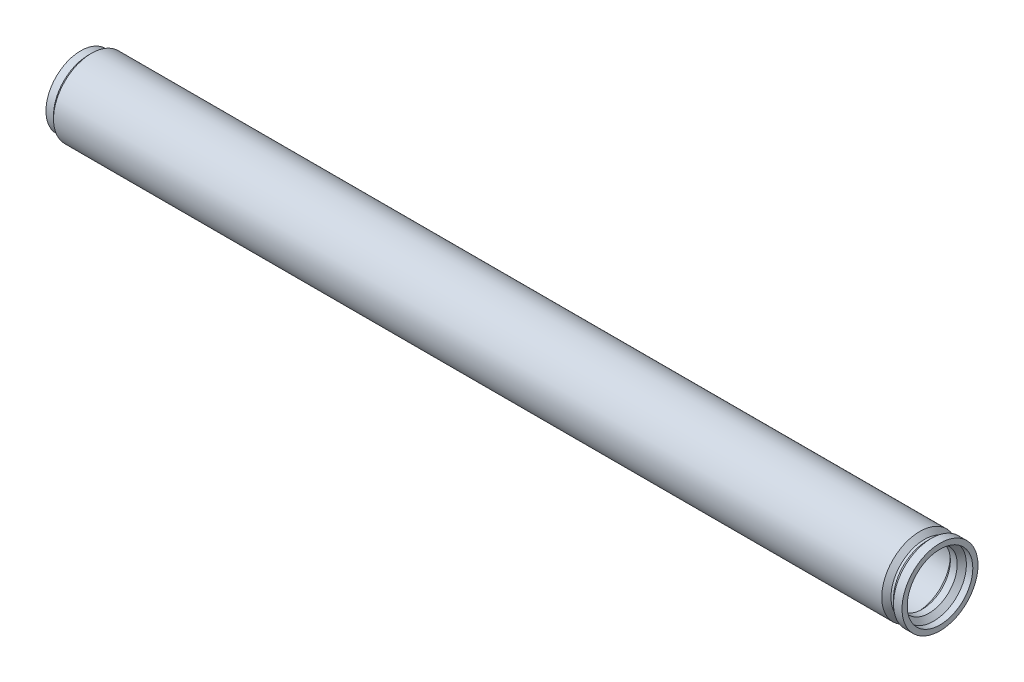
ISO-10303-21;
HEADER;
FILE_DESCRIPTION(('STEP AP214'),'2;1');
FILE_NAME('part.step','',(''),(''),'','','');
FILE_SCHEMA(('AUTOMOTIVE_DESIGN { 1 0 10303 214 1 1 1 1 }'));
ENDSEC;
DATA;
#1=APPLICATION_CONTEXT('core data for automotive mechanical design processes');
#2=APPLICATION_PROTOCOL_DEFINITION('international standard','automotive_design',2000,#1);
#3=PRODUCT_CONTEXT('',#1,'mechanical');
#4=PRODUCT('Part','Part','',(#3));
#5=PRODUCT_RELATED_PRODUCT_CATEGORY('part','',(#4));
#6=PRODUCT_DEFINITION_FORMATION('','',#4);
#7=PRODUCT_DEFINITION_CONTEXT('part definition',#1,'design');
#8=PRODUCT_DEFINITION('design','',#6,#7);
#9=PRODUCT_DEFINITION_SHAPE('','',#8);
#10=(LENGTH_UNIT() NAMED_UNIT(*) SI_UNIT(.MILLI.,.METRE.));
#11=(NAMED_UNIT(*) PLANE_ANGLE_UNIT() SI_UNIT($,.RADIAN.));
#12=(NAMED_UNIT(*) SI_UNIT($,.STERADIAN.) SOLID_ANGLE_UNIT());
#13=UNCERTAINTY_MEASURE_WITH_UNIT(LENGTH_MEASURE(1.E-05),#10,'distance_accuracy_value','');
#14=(GEOMETRIC_REPRESENTATION_CONTEXT(3) GLOBAL_UNCERTAINTY_ASSIGNED_CONTEXT((#13)) GLOBAL_UNIT_ASSIGNED_CONTEXT((#10,
#11,#12)) REPRESENTATION_CONTEXT('',''));
#15=CARTESIAN_POINT('',(0.,0.,0.));
#16=DIRECTION('',(0.,0.,1.));
#17=DIRECTION('',(1.,0.,0.));
#18=AXIS2_PLACEMENT_3D('',#15,#16,#17);
#19=CARTESIAN_POINT('',(0.,13.8074,0.));
#20=DIRECTION('',(-1.,0.,0.));
#21=DIRECTION('',(0.,0.,1.));
#22=AXIS2_PLACEMENT_3D('',#19,#20,#21);
#23=PLANE('',#22);
#24=CARTESIAN_POINT('',(0.,0.,0.));
#25=DIRECTION('',(1.,0.,0.));
#26=DIRECTION('',(0.,0.,-1.));
#27=AXIS2_PLACEMENT_3D('',#24,#25,#26);
#28=CIRCLE('',#27,11.75);
#29=CARTESIAN_POINT('',(0.,0.,-11.75));
#30=VERTEX_POINT('',#29);
#31=EDGE_CURVE('E69',#30,#30,#28,.T.);
#32=ORIENTED_EDGE('',*,*,#31,.T.);
#33=EDGE_LOOP('',(#32));
#34=FACE_BOUND('',#33,.T.);
#35=CARTESIAN_POINT('',(0.,0.,0.));
#36=DIRECTION('',(1.,0.,0.));
#37=DIRECTION('',(0.,0.,-1.));
#38=AXIS2_PLACEMENT_3D('',#35,#36,#37);
#39=CIRCLE('',#38,13.8074);
#40=CARTESIAN_POINT('',(0.,0.,-13.8074));
#41=VERTEX_POINT('',#40);
#42=EDGE_CURVE('E65',#41,#41,#39,.T.);
#43=ORIENTED_EDGE('',*,*,#42,.F.);
#44=EDGE_LOOP('',(#43));
#45=FACE_BOUND('',#44,.T.);
#46=ADVANCED_FACE('F15',(#34,#45),#23,.T.);
#47=CARTESIAN_POINT('',(341.,0.,0.));
#48=DIRECTION('',(1.,0.,0.));
#49=DIRECTION('',(0.,0.,-1.));
#50=AXIS2_PLACEMENT_3D('',#47,#48,#49);
#51=CYLINDRICAL_SURFACE('',#50,11.75);
#52=CARTESIAN_POINT('',(3.85220298000002,0.,0.));
#53=DIRECTION('',(1.,0.,0.));
#54=DIRECTION('',(0.,0.,-1.));
#55=AXIS2_PLACEMENT_3D('',#52,#53,#54);
#56=CIRCLE('',#55,11.75);
#57=CARTESIAN_POINT('',(3.85220298000002,0.,-11.75));
#58=VERTEX_POINT('',#57);
#59=EDGE_CURVE('E62',#58,#58,#56,.T.);
#60=ORIENTED_EDGE('',*,*,#59,.T.);
#61=EDGE_LOOP('',(#60));
#62=FACE_BOUND('',#61,.T.);
#63=ORIENTED_EDGE('',*,*,#31,.F.);
#64=EDGE_LOOP('',(#63));
#65=FACE_BOUND('',#64,.T.);
#66=ADVANCED_FACE('F72',(#62,#65),#51,.F.);
#67=CARTESIAN_POINT('',(3.85220298,0.,0.));
#68=DIRECTION('',(1.,0.,0.));
#69=DIRECTION('',(0.,0.,-1.));
#70=AXIS2_PLACEMENT_3D('',#67,#68,#69);
#71=CONICAL_SURFACE('',#70,11.75,0.785398163397457);
#72=CARTESIAN_POINT('',(5.11970297999997,0.,0.));
#73=DIRECTION('',(1.,0.,0.));
#74=DIRECTION('',(0.,0.,-1.));
#75=AXIS2_PLACEMENT_3D('',#72,#73,#74);
#76=CIRCLE('',#75,13.0175);
#77=CARTESIAN_POINT('',(5.11970297999997,0.,-13.0175));
#78=VERTEX_POINT('',#77);
#79=EDGE_CURVE('E56',#78,#78,#76,.T.);
#80=ORIENTED_EDGE('',*,*,#79,.T.);
#81=EDGE_LOOP('',(#80));
#82=FACE_BOUND('',#81,.T.);
#83=ORIENTED_EDGE('',*,*,#59,.F.);
#84=EDGE_LOOP('',(#83));
#85=FACE_BOUND('',#84,.T.);
#86=ADVANCED_FACE('F76',(#82,#85),#71,.F.);
#87=CARTESIAN_POINT('',(341.,0.,0.));
#88=DIRECTION('',(1.,0.,0.));
#89=DIRECTION('',(0.,0.,-1.));
#90=AXIS2_PLACEMENT_3D('',#87,#88,#89);
#91=CYLINDRICAL_SURFACE('',#90,13.0175);
#92=CARTESIAN_POINT('',(332.09559403,0.,0.));
#93=DIRECTION('',(1.,0.,0.));
#94=DIRECTION('',(0.,0.,-1.));
#95=AXIS2_PLACEMENT_3D('',#92,#93,#94);
#96=CIRCLE('',#95,13.0175);
#97=CARTESIAN_POINT('',(332.09559403,0.,-13.0175));
#98=VERTEX_POINT('',#97);
#99=EDGE_CURVE('E57',#98,#98,#96,.T.);
#100=ORIENTED_EDGE('',*,*,#99,.T.);
#101=EDGE_LOOP('',(#100));
#102=FACE_BOUND('',#101,.T.);
#103=ORIENTED_EDGE('',*,*,#79,.F.);
#104=EDGE_LOOP('',(#103));
#105=FACE_BOUND('',#104,.T.);
#106=ADVANCED_FACE('F81',(#102,#105),#91,.F.);
#107=CARTESIAN_POINT('',(332.09559403,0.,0.));
#108=DIRECTION('',(-1.,0.,0.));
#109=DIRECTION('',(0.,0.,1.));
#110=AXIS2_PLACEMENT_3D('',#107,#108,#109);
#111=CONICAL_SURFACE('',#110,13.0175,0.785398163397449);
#112=CARTESIAN_POINT('',(333.92559403,0.,0.));
#113=DIRECTION('',(1.,0.,0.));
#114=DIRECTION('',(0.,0.,-1.));
#115=AXIS2_PLACEMENT_3D('',#112,#113,#114);
#116=CIRCLE('',#115,11.1875);
#117=CARTESIAN_POINT('',(333.92559403,0.,-11.1875));
#118=VERTEX_POINT('',#117);
#119=EDGE_CURVE('E52',#118,#118,#116,.T.);
#120=ORIENTED_EDGE('',*,*,#119,.T.);
#121=EDGE_LOOP('',(#120));
#122=FACE_BOUND('',#121,.T.);
#123=ORIENTED_EDGE('',*,*,#99,.F.);
#124=EDGE_LOOP('',(#123));
#125=FACE_BOUND('',#124,.T.);
#126=ADVANCED_FACE('F93',(#122,#125),#111,.F.);
#127=CARTESIAN_POINT('',(341.,0.,0.));
#128=DIRECTION('',(1.,0.,0.));
#129=DIRECTION('',(0.,0.,-1.));
#130=AXIS2_PLACEMENT_3D('',#127,#128,#129);
#131=CYLINDRICAL_SURFACE('',#130,11.1875);
#132=CARTESIAN_POINT('',(336.63,0.,0.));
#133=DIRECTION('',(1.,0.,0.));
#134=DIRECTION('',(0.,0.,-1.));
#135=AXIS2_PLACEMENT_3D('',#132,#133,#134);
#136=CIRCLE('',#135,11.1875);
#137=CARTESIAN_POINT('',(336.63,0.,-11.1875));
#138=VERTEX_POINT('',#137);
#139=EDGE_CURVE('E49',#138,#138,#136,.T.);
#140=ORIENTED_EDGE('',*,*,#139,.T.);
#141=EDGE_LOOP('',(#140));
#142=FACE_BOUND('',#141,.T.);
#143=ORIENTED_EDGE('',*,*,#119,.F.);
#144=EDGE_LOOP('',(#143));
#145=FACE_BOUND('',#144,.T.);
#146=ADVANCED_FACE('F92',(#142,#145),#131,.F.);
#147=CARTESIAN_POINT('',(336.63,0.,0.));
#148=DIRECTION('',(1.,0.,0.));
#149=DIRECTION('',(0.,0.,-1.));
#150=AXIS2_PLACEMENT_3D('',#147,#148,#149);
#151=CONICAL_SURFACE('',#150,11.1875,0.785398163397449);
#152=CARTESIAN_POINT('',(338.46,0.,0.));
#153=DIRECTION('',(1.,0.,0.));
#154=DIRECTION('',(0.,0.,-1.));
#155=AXIS2_PLACEMENT_3D('',#152,#153,#154);
#156=CIRCLE('',#155,13.0175);
#157=CARTESIAN_POINT('',(338.46,0.,-13.0175));
#158=VERTEX_POINT('',#157);
#159=EDGE_CURVE('E50',#158,#158,#156,.T.);
#160=ORIENTED_EDGE('',*,*,#159,.T.);
#161=EDGE_LOOP('',(#160));
#162=FACE_BOUND('',#161,.T.);
#163=ORIENTED_EDGE('',*,*,#139,.F.);
#164=EDGE_LOOP('',(#163));
#165=FACE_BOUND('',#164,.T.);
#166=ADVANCED_FACE('F97',(#162,#165),#151,.F.);
#167=CARTESIAN_POINT('',(341.,0.,0.));
#168=DIRECTION('',(1.,0.,0.));
#169=DIRECTION('',(0.,0.,-1.));
#170=AXIS2_PLACEMENT_3D('',#167,#168,#169);
#171=CYLINDRICAL_SURFACE('',#170,13.0175);
#172=CARTESIAN_POINT('',(341.,0.,0.));
#173=DIRECTION('',(1.,0.,0.));
#174=DIRECTION('',(0.,0.,-1.));
#175=AXIS2_PLACEMENT_3D('',#172,#173,#174);
#176=CIRCLE('',#175,13.0175);
#177=CARTESIAN_POINT('',(341.,0.,-13.0175));
#178=VERTEX_POINT('',#177);
#179=EDGE_CURVE('E42',#178,#178,#176,.T.);
#180=ORIENTED_EDGE('',*,*,#179,.T.);
#181=EDGE_LOOP('',(#180));
#182=FACE_BOUND('',#181,.T.);
#183=ORIENTED_EDGE('',*,*,#159,.F.);
#184=EDGE_LOOP('',(#183));
#185=FACE_BOUND('',#184,.T.);
#186=ADVANCED_FACE('F103',(#182,#185),#171,.F.);
#187=CARTESIAN_POINT('',(341.,13.0175,0.));
#188=DIRECTION('',(1.,0.,0.));
#189=DIRECTION('',(0.,0.,-1.));
#190=AXIS2_PLACEMENT_3D('',#187,#188,#189);
#191=PLANE('',#190);
#192=CARTESIAN_POINT('',(341.,0.,0.));
#193=DIRECTION('',(1.,0.,0.));
#194=DIRECTION('',(0.,0.,-1.));
#195=AXIS2_PLACEMENT_3D('',#192,#193,#194);
#196=CIRCLE('',#195,15.0749);
#197=CARTESIAN_POINT('',(341.,0.,-15.0749));
#198=VERTEX_POINT('',#197);
#199=EDGE_CURVE('E41',#198,#198,#196,.T.);
#200=ORIENTED_EDGE('',*,*,#199,.T.);
#201=EDGE_LOOP('',(#200));
#202=FACE_BOUND('',#201,.T.);
#203=ORIENTED_EDGE('',*,*,#179,.F.);
#204=EDGE_LOOP('',(#203));
#205=FACE_BOUND('',#204,.T.);
#206=ADVANCED_FACE('F110',(#202,#205),#191,.T.);
#207=CARTESIAN_POINT('',(341.,0.,0.));
#208=DIRECTION('',(1.,0.,0.));
#209=DIRECTION('',(0.,0.,-1.));
#210=AXIS2_PLACEMENT_3D('',#207,#208,#209);
#211=CYLINDRICAL_SURFACE('',#210,15.0749);
#212=CARTESIAN_POINT('',(337.60779702,0.,0.));
#213=DIRECTION('',(1.,0.,0.));
#214=DIRECTION('',(0.,0.,-1.));
#215=AXIS2_PLACEMENT_3D('',#212,#213,#214);
#216=CIRCLE('',#215,15.0749);
#217=CARTESIAN_POINT('',(337.60779702,0.,-15.0749));
#218=VERTEX_POINT('',#217);
#219=EDGE_CURVE('E36',#218,#218,#216,.T.);
#220=ORIENTED_EDGE('',*,*,#219,.T.);
#221=EDGE_LOOP('',(#220));
#222=FACE_BOUND('',#221,.T.);
#223=ORIENTED_EDGE('',*,*,#199,.F.);
#224=EDGE_LOOP('',(#223));
#225=FACE_BOUND('',#224,.T.);
#226=ADVANCED_FACE('F112',(#222,#225),#211,.T.);
#227=CARTESIAN_POINT('',(337.60779702,0.,0.));
#228=DIRECTION('',(1.,0.,0.));
#229=DIRECTION('',(0.,0.,-1.));
#230=AXIS2_PLACEMENT_3D('',#227,#228,#229);
#231=CONICAL_SURFACE('',#230,15.0749,0.785398163397434);
#232=CARTESIAN_POINT('',(335.77779702,0.,0.));
#233=DIRECTION('',(1.,0.,0.));
#234=DIRECTION('',(0.,0.,-1.));
#235=AXIS2_PLACEMENT_3D('',#232,#233,#234);
#236=CIRCLE('',#235,13.2449);
#237=CARTESIAN_POINT('',(335.77779702,0.,-13.2449));
#238=VERTEX_POINT('',#237);
#239=EDGE_CURVE('E34',#238,#238,#236,.T.);
#240=ORIENTED_EDGE('',*,*,#239,.T.);
#241=EDGE_LOOP('',(#240));
#242=FACE_BOUND('',#241,.T.);
#243=ORIENTED_EDGE('',*,*,#219,.F.);
#244=EDGE_LOOP('',(#243));
#245=FACE_BOUND('',#244,.T.);
#246=ADVANCED_FACE('F113',(#242,#245),#231,.T.);
#247=CARTESIAN_POINT('',(341.,0.,0.));
#248=DIRECTION('',(1.,0.,0.));
#249=DIRECTION('',(0.,0.,-1.));
#250=AXIS2_PLACEMENT_3D('',#247,#248,#249);
#251=CYLINDRICAL_SURFACE('',#250,13.2449);
#252=CARTESIAN_POINT('',(334.77779702,0.,0.));
#253=DIRECTION('',(1.,0.,0.));
#254=DIRECTION('',(0.,0.,-1.));
#255=AXIS2_PLACEMENT_3D('',#252,#253,#254);
#256=CIRCLE('',#255,13.2449);
#257=CARTESIAN_POINT('',(334.77779702,0.,-13.2449));
#258=VERTEX_POINT('',#257);
#259=EDGE_CURVE('E28',#258,#258,#256,.T.);
#260=ORIENTED_EDGE('',*,*,#259,.T.);
#261=EDGE_LOOP('',(#260));
#262=FACE_BOUND('',#261,.T.);
#263=ORIENTED_EDGE('',*,*,#239,.F.);
#264=EDGE_LOOP('',(#263));
#265=FACE_BOUND('',#264,.T.);
#266=ADVANCED_FACE('F118',(#262,#265),#251,.T.);
#267=CARTESIAN_POINT('',(334.77779702,0.,0.));
#268=DIRECTION('',(-1.,0.,0.));
#269=DIRECTION('',(0.,0.,1.));
#270=AXIS2_PLACEMENT_3D('',#267,#268,#269);
#271=CONICAL_SURFACE('',#270,13.2449,0.785398163397449);
#272=CARTESIAN_POINT('',(332.94779702,0.,0.));
#273=DIRECTION('',(1.,0.,0.));
#274=DIRECTION('',(0.,0.,-1.));
#275=AXIS2_PLACEMENT_3D('',#272,#273,#274);
#276=CIRCLE('',#275,15.0749);
#277=CARTESIAN_POINT('',(332.94779702,0.,-15.0749));
#278=VERTEX_POINT('',#277);
#279=EDGE_CURVE('E27',#278,#278,#276,.T.);
#280=ORIENTED_EDGE('',*,*,#279,.T.);
#281=EDGE_LOOP('',(#280));
#282=FACE_BOUND('',#281,.T.);
#283=ORIENTED_EDGE('',*,*,#259,.F.);
#284=EDGE_LOOP('',(#283));
#285=FACE_BOUND('',#284,.T.);
#286=ADVANCED_FACE('F124',(#282,#285),#271,.T.);
#287=CARTESIAN_POINT('',(341.,0.,0.));
#288=DIRECTION('',(1.,0.,0.));
#289=DIRECTION('',(0.,0.,-1.));
#290=AXIS2_PLACEMENT_3D('',#287,#288,#289);
#291=CYLINDRICAL_SURFACE('',#290,15.0749);
#292=CARTESIAN_POINT('',(4.26749999999998,0.,0.));
#293=DIRECTION('',(1.,0.,0.));
#294=DIRECTION('',(0.,0.,-1.));
#295=AXIS2_PLACEMENT_3D('',#292,#293,#294);
#296=CIRCLE('',#295,15.0749);
#297=CARTESIAN_POINT('',(4.26749999999998,0.,-15.0749));
#298=VERTEX_POINT('',#297);
#299=EDGE_CURVE('E22',#298,#298,#296,.T.);
#300=ORIENTED_EDGE('',*,*,#299,.T.);
#301=EDGE_LOOP('',(#300));
#302=FACE_BOUND('',#301,.T.);
#303=ORIENTED_EDGE('',*,*,#279,.F.);
#304=EDGE_LOOP('',(#303));
#305=FACE_BOUND('',#304,.T.);
#306=ADVANCED_FACE('F126',(#302,#305),#291,.T.);
#307=CARTESIAN_POINT('',(4.2675,0.,0.));
#308=DIRECTION('',(1.,0.,0.));
#309=DIRECTION('',(0.,0.,-1.));
#310=AXIS2_PLACEMENT_3D('',#307,#308,#309);
#311=CONICAL_SURFACE('',#310,15.0749,0.785398163397436);
#312=CARTESIAN_POINT('',(3.,0.,0.));
#313=DIRECTION('',(1.,0.,0.));
#314=DIRECTION('',(0.,0.,-1.));
#315=AXIS2_PLACEMENT_3D('',#312,#313,#314);
#316=CIRCLE('',#315,13.8074);
#317=CARTESIAN_POINT('',(3.,0.,-13.8074));
#318=VERTEX_POINT('',#317);
#319=EDGE_CURVE('E10',#318,#318,#316,.T.);
#320=ORIENTED_EDGE('',*,*,#319,.T.);
#321=EDGE_LOOP('',(#320));
#322=FACE_BOUND('',#321,.T.);
#323=ORIENTED_EDGE('',*,*,#299,.F.);
#324=EDGE_LOOP('',(#323));
#325=FACE_BOUND('',#324,.T.);
#326=ADVANCED_FACE('F129',(#322,#325),#311,.T.);
#327=CARTESIAN_POINT('',(341.,0.,0.));
#328=DIRECTION('',(1.,0.,0.));
#329=DIRECTION('',(0.,0.,-1.));
#330=AXIS2_PLACEMENT_3D('',#327,#328,#329);
#331=CYLINDRICAL_SURFACE('',#330,13.8074);
#332=ORIENTED_EDGE('',*,*,#42,.T.);
#333=EDGE_LOOP('',(#332));
#334=FACE_BOUND('',#333,.T.);
#335=ORIENTED_EDGE('',*,*,#319,.F.);
#336=EDGE_LOOP('',(#335));
#337=FACE_BOUND('',#336,.T.);
#338=ADVANCED_FACE('F17',(#334,#337),#331,.T.);
#339=CLOSED_SHELL('',(#46,#66,#86,#106,#126,#146,#166,#186,#206,#226,#246,#266,#286,#306,#326,#338));
#340=MANIFOLD_SOLID_BREP('B1',#339);
#341=ADVANCED_BREP_SHAPE_REPRESENTATION('',(#18,#340),#14);
#342=SHAPE_DEFINITION_REPRESENTATION(#9,#341);
ENDSEC;
END-ISO-10303-21;
